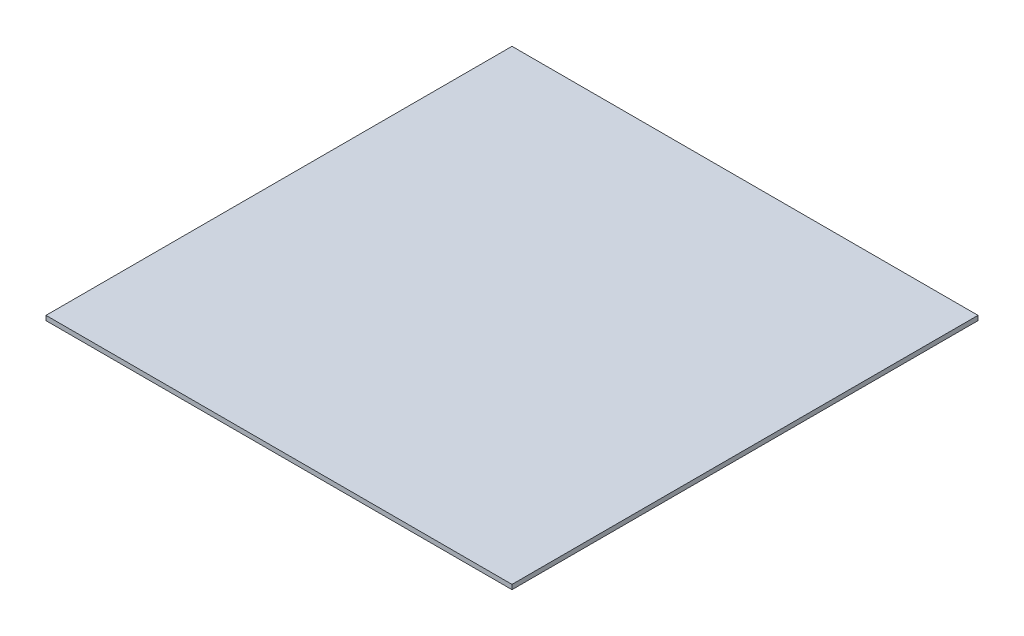
ISO-10303-21;
HEADER;
FILE_DESCRIPTION(('STEP AP214'),'2;1');
FILE_NAME('part.step','',(''),(''),'','','');
FILE_SCHEMA(('AUTOMOTIVE_DESIGN { 1 0 10303 214 1 1 1 1 }'));
ENDSEC;
DATA;
#1=APPLICATION_CONTEXT('core data for automotive mechanical design processes');
#2=APPLICATION_PROTOCOL_DEFINITION('international standard','automotive_design',2000,#1);
#3=PRODUCT_CONTEXT('',#1,'mechanical');
#4=PRODUCT('Part','Part','',(#3));
#5=PRODUCT_RELATED_PRODUCT_CATEGORY('part','',(#4));
#6=PRODUCT_DEFINITION_FORMATION('','',#4);
#7=PRODUCT_DEFINITION_CONTEXT('part definition',#1,'design');
#8=PRODUCT_DEFINITION('design','',#6,#7);
#9=PRODUCT_DEFINITION_SHAPE('','',#8);
#10=(LENGTH_UNIT() NAMED_UNIT(*) SI_UNIT(.MILLI.,.METRE.));
#11=(NAMED_UNIT(*) PLANE_ANGLE_UNIT() SI_UNIT($,.RADIAN.));
#12=(NAMED_UNIT(*) SI_UNIT($,.STERADIAN.) SOLID_ANGLE_UNIT());
#13=UNCERTAINTY_MEASURE_WITH_UNIT(LENGTH_MEASURE(1.E-05),#10,'distance_accuracy_value','');
#14=(GEOMETRIC_REPRESENTATION_CONTEXT(3) GLOBAL_UNCERTAINTY_ASSIGNED_CONTEXT((#13)) GLOBAL_UNIT_ASSIGNED_CONTEXT((#10,
#11,#12)) REPRESENTATION_CONTEXT('',''));
#15=CARTESIAN_POINT('',(0.,0.,0.));
#16=DIRECTION('',(0.,0.,1.));
#17=DIRECTION('',(1.,0.,0.));
#18=AXIS2_PLACEMENT_3D('',#15,#16,#17);
#19=CARTESIAN_POINT('',(101.,2.,-101.));
#20=DIRECTION('',(-1.,0.,0.));
#21=DIRECTION('',(0.,0.,1.));
#22=AXIS2_PLACEMENT_3D('',#19,#20,#21);
#23=PLANE('',#22);
#24=DIRECTION('',(0.,0.,-1.));
#25=VECTOR('',#24,1.);
#26=CARTESIAN_POINT('',(101.,0.,-101.));
#27=LINE('',#26,#25);
#28=CARTESIAN_POINT('',(101.,0.,101.));
#29=VERTEX_POINT('',#28);
#30=CARTESIAN_POINT('',(101.,0.,-101.));
#31=VERTEX_POINT('',#30);
#32=EDGE_CURVE('E104',#29,#31,#27,.T.);
#33=ORIENTED_EDGE('',*,*,#32,.T.);
#34=DIRECTION('',(0.,-1.,0.));
#35=VECTOR('',#34,1.);
#36=CARTESIAN_POINT('',(101.,2.,-101.));
#37=LINE('',#36,#35);
#38=CARTESIAN_POINT('',(101.,2.,-101.));
#39=VERTEX_POINT('',#38);
#40=EDGE_CURVE('E11',#39,#31,#37,.T.);
#41=ORIENTED_EDGE('',*,*,#40,.F.);
#42=DIRECTION('',(0.,0.,-1.));
#43=VECTOR('',#42,1.);
#44=CARTESIAN_POINT('',(101.,2.,-101.));
#45=LINE('',#44,#43);
#46=CARTESIAN_POINT('',(101.,2.,101.));
#47=VERTEX_POINT('',#46);
#48=EDGE_CURVE('E92',#47,#39,#45,.T.);
#49=ORIENTED_EDGE('',*,*,#48,.F.);
#50=DIRECTION('',(0.,-1.,0.));
#51=VECTOR('',#50,1.);
#52=CARTESIAN_POINT('',(101.,2.,101.));
#53=LINE('',#52,#51);
#54=EDGE_CURVE('E100',#47,#29,#53,.T.);
#55=ORIENTED_EDGE('',*,*,#54,.T.);
#56=EDGE_LOOP('',(#33,#41,#49,#55));
#57=FACE_BOUND('',#56,.T.);
#58=ADVANCED_FACE('F41',(#57),#23,.F.);
#59=CARTESIAN_POINT('',(-101.,2.,-101.));
#60=DIRECTION('',(0.,0.,1.));
#61=DIRECTION('',(1.,0.,0.));
#62=AXIS2_PLACEMENT_3D('',#59,#60,#61);
#63=PLANE('',#62);
#64=DIRECTION('',(-1.,0.,0.));
#65=VECTOR('',#64,1.);
#66=CARTESIAN_POINT('',(-101.,0.,-101.));
#67=LINE('',#66,#65);
#68=CARTESIAN_POINT('',(-101.,0.,-101.));
#69=VERTEX_POINT('',#68);
#70=EDGE_CURVE('E96',#31,#69,#67,.T.);
#71=ORIENTED_EDGE('',*,*,#70,.T.);
#72=DIRECTION('',(0.,-1.,0.));
#73=VECTOR('',#72,1.);
#74=CARTESIAN_POINT('',(-101.,2.,-101.));
#75=LINE('',#74,#73);
#76=CARTESIAN_POINT('',(-101.,2.,-101.));
#77=VERTEX_POINT('',#76);
#78=EDGE_CURVE('E49',#77,#69,#75,.T.);
#79=ORIENTED_EDGE('',*,*,#78,.F.);
#80=DIRECTION('',(-1.,0.,0.));
#81=VECTOR('',#80,1.);
#82=CARTESIAN_POINT('',(-101.,2.,-101.));
#83=LINE('',#82,#81);
#84=EDGE_CURVE('E87',#39,#77,#83,.T.);
#85=ORIENTED_EDGE('',*,*,#84,.F.);
#86=ORIENTED_EDGE('',*,*,#40,.T.);
#87=EDGE_LOOP('',(#71,#79,#85,#86));
#88=FACE_BOUND('',#87,.T.);
#89=ADVANCED_FACE('F95',(#88),#63,.F.);
#90=CARTESIAN_POINT('',(-101.,2.,-101.));
#91=DIRECTION('',(1.,0.,0.));
#92=DIRECTION('',(0.,0.,-1.));
#93=AXIS2_PLACEMENT_3D('',#90,#91,#92);
#94=PLANE('',#93);
#95=DIRECTION('',(0.,0.,1.));
#96=VECTOR('',#95,1.);
#97=CARTESIAN_POINT('',(-101.,0.,-101.));
#98=LINE('',#97,#96);
#99=CARTESIAN_POINT('',(-101.,0.,101.));
#100=VERTEX_POINT('',#99);
#101=EDGE_CURVE('E74',#69,#100,#98,.T.);
#102=ORIENTED_EDGE('',*,*,#101,.T.);
#103=DIRECTION('',(0.,-1.,0.));
#104=VECTOR('',#103,1.);
#105=CARTESIAN_POINT('',(-101.,2.,101.));
#106=LINE('',#105,#104);
#107=CARTESIAN_POINT('',(-101.,2.,101.));
#108=VERTEX_POINT('',#107);
#109=EDGE_CURVE('E97',#108,#100,#106,.T.);
#110=ORIENTED_EDGE('',*,*,#109,.F.);
#111=DIRECTION('',(0.,0.,1.));
#112=VECTOR('',#111,1.);
#113=CARTESIAN_POINT('',(-101.,2.,-101.));
#114=LINE('',#113,#112);
#115=EDGE_CURVE('E90',#77,#108,#114,.T.);
#116=ORIENTED_EDGE('',*,*,#115,.F.);
#117=ORIENTED_EDGE('',*,*,#78,.T.);
#118=EDGE_LOOP('',(#102,#110,#116,#117));
#119=FACE_BOUND('',#118,.T.);
#120=ADVANCED_FACE('F98',(#119),#94,.F.);
#121=CARTESIAN_POINT('',(-101.,2.,101.));
#122=DIRECTION('',(0.,0.,-1.));
#123=DIRECTION('',(-1.,0.,0.));
#124=AXIS2_PLACEMENT_3D('',#121,#122,#123);
#125=PLANE('',#124);
#126=DIRECTION('',(1.,0.,0.));
#127=VECTOR('',#126,1.);
#128=CARTESIAN_POINT('',(-101.,0.,101.));
#129=LINE('',#128,#127);
#130=EDGE_CURVE('E80',#100,#29,#129,.T.);
#131=ORIENTED_EDGE('',*,*,#130,.T.);
#132=ORIENTED_EDGE('',*,*,#54,.F.);
#133=DIRECTION('',(1.,0.,0.));
#134=VECTOR('',#133,1.);
#135=CARTESIAN_POINT('',(-101.,2.,101.));
#136=LINE('',#135,#134);
#137=EDGE_CURVE('E57',#108,#47,#136,.T.);
#138=ORIENTED_EDGE('',*,*,#137,.F.);
#139=ORIENTED_EDGE('',*,*,#109,.T.);
#140=EDGE_LOOP('',(#131,#132,#138,#139));
#141=FACE_BOUND('',#140,.T.);
#142=ADVANCED_FACE('F111',(#141),#125,.F.);
#143=CARTESIAN_POINT('',(0.,2.,0.));
#144=DIRECTION('',(0.,1.,0.));
#145=DIRECTION('',(0.,0.,1.));
#146=AXIS2_PLACEMENT_3D('',#143,#144,#145);
#147=PLANE('',#146);
#148=ORIENTED_EDGE('',*,*,#48,.T.);
#149=ORIENTED_EDGE('',*,*,#84,.T.);
#150=ORIENTED_EDGE('',*,*,#115,.T.);
#151=ORIENTED_EDGE('',*,*,#137,.T.);
#152=EDGE_LOOP('',(#148,#149,#150,#151));
#153=FACE_BOUND('',#152,.T.);
#154=ADVANCED_FACE('F88',(#153),#147,.T.);
#155=CARTESIAN_POINT('',(0.,0.,0.));
#156=DIRECTION('',(0.,1.,0.));
#157=DIRECTION('',(0.,0.,1.));
#158=AXIS2_PLACEMENT_3D('',#155,#156,#157);
#159=PLANE('',#158);
#160=ORIENTED_EDGE('',*,*,#32,.F.);
#161=ORIENTED_EDGE('',*,*,#130,.F.);
#162=ORIENTED_EDGE('',*,*,#101,.F.);
#163=ORIENTED_EDGE('',*,*,#70,.F.);
#164=EDGE_LOOP('',(#160,#161,#162,#163));
#165=FACE_BOUND('',#164,.T.);
#166=ADVANCED_FACE('F114',(#165),#159,.F.);
#167=CLOSED_SHELL('',(#58,#89,#120,#142,#154,#166));
#168=MANIFOLD_SOLID_BREP('B2',#167);
#169=ADVANCED_BREP_SHAPE_REPRESENTATION('',(#18,#168),#14);
#170=SHAPE_DEFINITION_REPRESENTATION(#9,#169);
ENDSEC;
END-ISO-10303-21;
